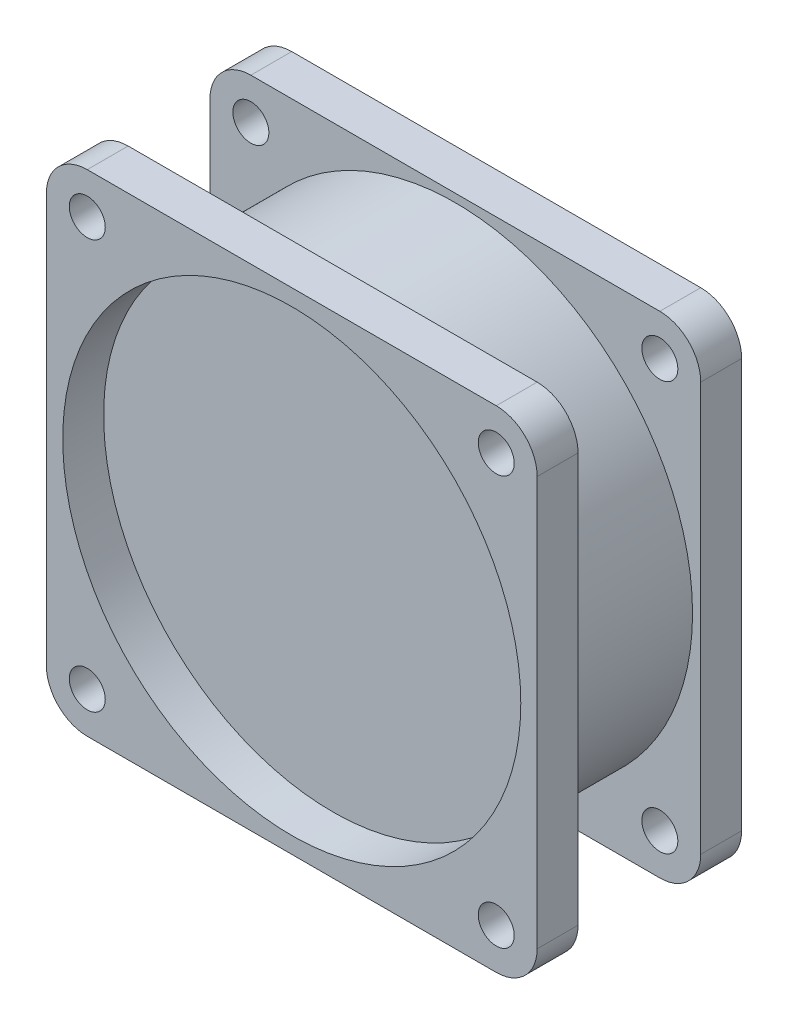
ISO-10303-21;
HEADER;
FILE_DESCRIPTION(('STEP AP214'),'2;1');
FILE_NAME('part.step','',(''),(''),'','','');
FILE_SCHEMA(('AUTOMOTIVE_DESIGN { 1 0 10303 214 1 1 1 1 }'));
ENDSEC;
DATA;
#1=APPLICATION_CONTEXT('core data for automotive mechanical design processes');
#2=APPLICATION_PROTOCOL_DEFINITION('international standard','automotive_design',2000,#1);
#3=PRODUCT_CONTEXT('',#1,'mechanical');
#4=PRODUCT('Part','Part','',(#3));
#5=PRODUCT_RELATED_PRODUCT_CATEGORY('part','',(#4));
#6=PRODUCT_DEFINITION_FORMATION('','',#4);
#7=PRODUCT_DEFINITION_CONTEXT('part definition',#1,'design');
#8=PRODUCT_DEFINITION('design','',#6,#7);
#9=PRODUCT_DEFINITION_SHAPE('','',#8);
#10=(LENGTH_UNIT() NAMED_UNIT(*) SI_UNIT(.MILLI.,.METRE.));
#11=(NAMED_UNIT(*) PLANE_ANGLE_UNIT() SI_UNIT($,.RADIAN.));
#12=(NAMED_UNIT(*) SI_UNIT($,.STERADIAN.) SOLID_ANGLE_UNIT());
#13=UNCERTAINTY_MEASURE_WITH_UNIT(LENGTH_MEASURE(1.E-05),#10,'distance_accuracy_value','');
#14=(GEOMETRIC_REPRESENTATION_CONTEXT(3) GLOBAL_UNCERTAINTY_ASSIGNED_CONTEXT((#13)) GLOBAL_UNIT_ASSIGNED_CONTEXT((#10,
#11,#12)) REPRESENTATION_CONTEXT('',''));
#15=CARTESIAN_POINT('',(0.,0.,0.));
#16=DIRECTION('',(0.,0.,1.));
#17=DIRECTION('',(1.,0.,0.));
#18=AXIS2_PLACEMENT_3D('',#15,#16,#17);
#19=CARTESIAN_POINT('',(0.,0.,5.));
#20=DIRECTION('',(-1.,0.,0.));
#21=DIRECTION('',(0.,0.,1.));
#22=AXIS2_PLACEMENT_3D('',#19,#20,#21);
#23=PLANE('',#22);
#24=DIRECTION('',(0.,1.,0.));
#25=VECTOR('',#24,1.);
#26=CARTESIAN_POINT('',(0.,0.,5.));
#27=LINE('',#26,#25);
#28=CARTESIAN_POINT('',(0.,-55.,5.));
#29=VERTEX_POINT('',#28);
#30=CARTESIAN_POINT('',(0.,-5.,5.));
#31=VERTEX_POINT('',#30);
#32=EDGE_CURVE('E175',#29,#31,#27,.T.);
#33=ORIENTED_EDGE('',*,*,#32,.F.);
#34=DIRECTION('',(0.,0.,-1.));
#35=VECTOR('',#34,1.);
#36=CARTESIAN_POINT('',(0.,-55.,5.));
#37=LINE('',#36,#35);
#38=CARTESIAN_POINT('',(0.,-55.,0.));
#39=VERTEX_POINT('',#38);
#40=EDGE_CURVE('E233',#29,#39,#37,.T.);
#41=ORIENTED_EDGE('',*,*,#40,.T.);
#42=DIRECTION('',(0.,1.,0.));
#43=VECTOR('',#42,1.);
#44=CARTESIAN_POINT('',(0.,0.,0.));
#45=LINE('',#44,#43);
#46=CARTESIAN_POINT('',(0.,-5.,0.));
#47=VERTEX_POINT('',#46);
#48=EDGE_CURVE('E309',#39,#47,#45,.T.);
#49=ORIENTED_EDGE('',*,*,#48,.T.);
#50=DIRECTION('',(0.,0.,-1.));
#51=VECTOR('',#50,1.);
#52=CARTESIAN_POINT('',(0.,-5.,5.));
#53=LINE('',#52,#51);
#54=EDGE_CURVE('E231',#47,#31,#53,.F.);
#55=ORIENTED_EDGE('',*,*,#54,.T.);
#56=EDGE_LOOP('',(#33,#41,#49,#55));
#57=FACE_BOUND('',#56,.T.);
#58=ADVANCED_FACE('F33',(#57),#23,.F.);
#59=CARTESIAN_POINT('',(0.,0.,5.));
#60=DIRECTION('',(0.,-1.,0.));
#61=DIRECTION('',(1.,0.,0.));
#62=AXIS2_PLACEMENT_3D('',#59,#60,#61);
#63=PLANE('',#62);
#64=DIRECTION('',(-1.,0.,0.));
#65=VECTOR('',#64,1.);
#66=CARTESIAN_POINT('',(0.,0.,0.));
#67=LINE('',#66,#65);
#68=CARTESIAN_POINT('',(-5.,0.,0.));
#69=VERTEX_POINT('',#68);
#70=CARTESIAN_POINT('',(-55.,0.,0.));
#71=VERTEX_POINT('',#70);
#72=EDGE_CURVE('E181',#69,#71,#67,.T.);
#73=ORIENTED_EDGE('',*,*,#72,.T.);
#74=DIRECTION('',(0.,0.,-1.));
#75=VECTOR('',#74,1.);
#76=CARTESIAN_POINT('',(-55.,0.,5.));
#77=LINE('',#76,#75);
#78=CARTESIAN_POINT('',(-55.,0.,5.));
#79=VERTEX_POINT('',#78);
#80=EDGE_CURVE('E11',#71,#79,#77,.F.);
#81=ORIENTED_EDGE('',*,*,#80,.T.);
#82=DIRECTION('',(-1.,0.,0.));
#83=VECTOR('',#82,1.);
#84=CARTESIAN_POINT('',(0.,0.,5.));
#85=LINE('',#84,#83);
#86=CARTESIAN_POINT('',(-5.,0.,5.));
#87=VERTEX_POINT('',#86);
#88=EDGE_CURVE('E179',#87,#79,#85,.T.);
#89=ORIENTED_EDGE('',*,*,#88,.F.);
#90=DIRECTION('',(0.,0.,-1.));
#91=VECTOR('',#90,1.);
#92=CARTESIAN_POINT('',(-5.,0.,5.));
#93=LINE('',#92,#91);
#94=EDGE_CURVE('E42',#87,#69,#93,.T.);
#95=ORIENTED_EDGE('',*,*,#94,.T.);
#96=EDGE_LOOP('',(#73,#81,#89,#95));
#97=FACE_BOUND('',#96,.T.);
#98=ADVANCED_FACE('F323',(#97),#63,.F.);
#99=CARTESIAN_POINT('',(-60.,0.,5.));
#100=DIRECTION('',(1.,0.,0.));
#101=DIRECTION('',(0.,1.,0.));
#102=AXIS2_PLACEMENT_3D('',#99,#100,#101);
#103=PLANE('',#102);
#104=DIRECTION('',(0.,-1.,0.));
#105=VECTOR('',#104,1.);
#106=CARTESIAN_POINT('',(-60.,0.,0.));
#107=LINE('',#106,#105);
#108=CARTESIAN_POINT('',(-60.,-5.00000000000001,0.));
#109=VERTEX_POINT('',#108);
#110=CARTESIAN_POINT('',(-60.,-55.,0.));
#111=VERTEX_POINT('',#110);
#112=EDGE_CURVE('E176',#109,#111,#107,.T.);
#113=ORIENTED_EDGE('',*,*,#112,.T.);
#114=DIRECTION('',(0.,0.,-1.));
#115=VECTOR('',#114,1.);
#116=CARTESIAN_POINT('',(-60.,-55.,5.));
#117=LINE('',#116,#115);
#118=CARTESIAN_POINT('',(-60.,-55.,5.));
#119=VERTEX_POINT('',#118);
#120=EDGE_CURVE('E154',#111,#119,#117,.F.);
#121=ORIENTED_EDGE('',*,*,#120,.T.);
#122=DIRECTION('',(0.,-1.,0.));
#123=VECTOR('',#122,1.);
#124=CARTESIAN_POINT('',(-60.,0.,5.));
#125=LINE('',#124,#123);
#126=CARTESIAN_POINT('',(-60.,-5.00000000000001,5.));
#127=VERTEX_POINT('',#126);
#128=EDGE_CURVE('E314',#127,#119,#125,.T.);
#129=ORIENTED_EDGE('',*,*,#128,.F.);
#130=DIRECTION('',(0.,0.,-1.));
#131=VECTOR('',#130,1.);
#132=CARTESIAN_POINT('',(-60.,-5.00000000000001,5.));
#133=LINE('',#132,#131);
#134=EDGE_CURVE('E159',#127,#109,#133,.T.);
#135=ORIENTED_EDGE('',*,*,#134,.T.);
#136=EDGE_LOOP('',(#113,#121,#129,#135));
#137=FACE_BOUND('',#136,.T.);
#138=ADVANCED_FACE('F334',(#137),#103,.F.);
#139=CARTESIAN_POINT('',(0.,-60.,5.));
#140=DIRECTION('',(0.,1.,0.));
#141=DIRECTION('',(-1.,0.,0.));
#142=AXIS2_PLACEMENT_3D('',#139,#140,#141);
#143=PLANE('',#142);
#144=DIRECTION('',(1.,0.,0.));
#145=VECTOR('',#144,1.);
#146=CARTESIAN_POINT('',(0.,-60.,5.));
#147=LINE('',#146,#145);
#148=CARTESIAN_POINT('',(-55.,-60.,5.));
#149=VERTEX_POINT('',#148);
#150=CARTESIAN_POINT('',(-5.,-60.,5.));
#151=VERTEX_POINT('',#150);
#152=EDGE_CURVE('E169',#149,#151,#147,.T.);
#153=ORIENTED_EDGE('',*,*,#152,.F.);
#154=DIRECTION('',(0.,0.,-1.));
#155=VECTOR('',#154,1.);
#156=CARTESIAN_POINT('',(-55.,-60.,5.));
#157=LINE('',#156,#155);
#158=CARTESIAN_POINT('',(-55.,-60.,0.));
#159=VERTEX_POINT('',#158);
#160=EDGE_CURVE('E153',#149,#159,#157,.T.);
#161=ORIENTED_EDGE('',*,*,#160,.T.);
#162=DIRECTION('',(1.,0.,0.));
#163=VECTOR('',#162,1.);
#164=CARTESIAN_POINT('',(0.,-60.,0.));
#165=LINE('',#164,#163);
#166=CARTESIAN_POINT('',(-5.,-60.,0.));
#167=VERTEX_POINT('',#166);
#168=EDGE_CURVE('E166',#159,#167,#165,.T.);
#169=ORIENTED_EDGE('',*,*,#168,.T.);
#170=DIRECTION('',(0.,0.,-1.));
#171=VECTOR('',#170,1.);
#172=CARTESIAN_POINT('',(-5.,-60.,5.));
#173=LINE('',#172,#171);
#174=EDGE_CURVE('E171',#167,#151,#173,.F.);
#175=ORIENTED_EDGE('',*,*,#174,.T.);
#176=EDGE_LOOP('',(#153,#161,#169,#175));
#177=FACE_BOUND('',#176,.T.);
#178=ADVANCED_FACE('F165',(#177),#143,.F.);
#179=CARTESIAN_POINT('',(0.,0.,5.));
#180=DIRECTION('',(0.,0.,-1.));
#181=DIRECTION('',(-1.,0.,0.));
#182=AXIS2_PLACEMENT_3D('',#179,#180,#181);
#183=PLANE('',#182);
#184=CARTESIAN_POINT('',(-30.,-30.,5.));
#185=DIRECTION('',(0.,0.,1.));
#186=DIRECTION('',(1.,0.,0.));
#187=AXIS2_PLACEMENT_3D('',#184,#185,#186);
#188=CIRCLE('',#187,28.);
#189=CARTESIAN_POINT('',(-1.99999999999999,-30.,5.));
#190=VERTEX_POINT('',#189);
#191=EDGE_CURVE('E679',#190,#190,#188,.T.);
#192=ORIENTED_EDGE('',*,*,#191,.F.);
#193=EDGE_LOOP('',(#192));
#194=FACE_BOUND('',#193,.T.);
#195=CARTESIAN_POINT('',(-54.9999999999995,-55.,5.));
#196=DIRECTION('',(0.,0.,1.));
#197=DIRECTION('',(1.,0.,0.));
#198=AXIS2_PLACEMENT_3D('',#195,#196,#197);
#199=CIRCLE('',#198,2.2);
#200=CARTESIAN_POINT('',(-52.7999999999995,-55.,5.));
#201=VERTEX_POINT('',#200);
#202=EDGE_CURVE('E667',#201,#201,#199,.T.);
#203=ORIENTED_EDGE('',*,*,#202,.F.);
#204=EDGE_LOOP('',(#203));
#205=FACE_BOUND('',#204,.T.);
#206=CARTESIAN_POINT('',(-4.99999999999948,-55.,5.));
#207=DIRECTION('',(0.,0.,1.));
#208=DIRECTION('',(1.,0.,0.));
#209=AXIS2_PLACEMENT_3D('',#206,#207,#208);
#210=CIRCLE('',#209,2.2);
#211=CARTESIAN_POINT('',(-2.79999999999948,-55.,5.));
#212=VERTEX_POINT('',#211);
#213=EDGE_CURVE('E261',#212,#212,#210,.T.);
#214=ORIENTED_EDGE('',*,*,#213,.F.);
#215=EDGE_LOOP('',(#214));
#216=FACE_BOUND('',#215,.T.);
#217=CARTESIAN_POINT('',(-5.,-5.,5.));
#218=DIRECTION('',(0.,0.,1.));
#219=DIRECTION('',(1.,0.,0.));
#220=AXIS2_PLACEMENT_3D('',#217,#218,#219);
#221=CIRCLE('',#220,2.2);
#222=CARTESIAN_POINT('',(-2.8,-5.,5.));
#223=VERTEX_POINT('',#222);
#224=EDGE_CURVE('E258',#223,#223,#221,.T.);
#225=ORIENTED_EDGE('',*,*,#224,.F.);
#226=EDGE_LOOP('',(#225));
#227=FACE_BOUND('',#226,.T.);
#228=CARTESIAN_POINT('',(-55.,-5.,5.));
#229=DIRECTION('',(0.,0.,1.));
#230=DIRECTION('',(1.,0.,0.));
#231=AXIS2_PLACEMENT_3D('',#228,#229,#230);
#232=CIRCLE('',#231,2.2);
#233=CARTESIAN_POINT('',(-52.8,-5.,5.));
#234=VERTEX_POINT('',#233);
#235=EDGE_CURVE('E277',#234,#234,#232,.T.);
#236=ORIENTED_EDGE('',*,*,#235,.F.);
#237=EDGE_LOOP('',(#236));
#238=FACE_BOUND('',#237,.T.);
#239=ORIENTED_EDGE('',*,*,#128,.T.);
#240=CARTESIAN_POINT('',(-55.,-55.,5.));
#241=DIRECTION('',(0.,0.,-1.));
#242=DIRECTION('',(-1.,0.,0.));
#243=AXIS2_PLACEMENT_3D('',#240,#241,#242);
#244=CIRCLE('',#243,5.);
#245=EDGE_CURVE('E199',#119,#149,#244,.F.);
#246=ORIENTED_EDGE('',*,*,#245,.T.);
#247=ORIENTED_EDGE('',*,*,#152,.T.);
#248=CARTESIAN_POINT('',(-5.,-55.,5.));
#249=DIRECTION('',(0.,0.,-1.));
#250=DIRECTION('',(-1.,0.,0.));
#251=AXIS2_PLACEMENT_3D('',#248,#249,#250);
#252=CIRCLE('',#251,5.);
#253=EDGE_CURVE('E197',#151,#29,#252,.F.);
#254=ORIENTED_EDGE('',*,*,#253,.T.);
#255=ORIENTED_EDGE('',*,*,#32,.T.);
#256=CARTESIAN_POINT('',(-5.,-5.,5.));
#257=DIRECTION('',(0.,0.,-1.));
#258=DIRECTION('',(-1.,0.,0.));
#259=AXIS2_PLACEMENT_3D('',#256,#257,#258);
#260=CIRCLE('',#259,5.);
#261=EDGE_CURVE('E193',#31,#87,#260,.F.);
#262=ORIENTED_EDGE('',*,*,#261,.T.);
#263=ORIENTED_EDGE('',*,*,#88,.T.);
#264=CARTESIAN_POINT('',(-55.,-5.00000000000001,5.));
#265=DIRECTION('',(0.,0.,-1.));
#266=DIRECTION('',(-1.,0.,0.));
#267=AXIS2_PLACEMENT_3D('',#264,#265,#266);
#268=CIRCLE('',#267,5.);
#269=EDGE_CURVE('E195',#79,#127,#268,.F.);
#270=ORIENTED_EDGE('',*,*,#269,.T.);
#271=EDGE_LOOP('',(#239,#246,#247,#254,#255,#262,#263,#270));
#272=FACE_BOUND('',#271,.T.);
#273=ADVANCED_FACE('F332',(#194,#205,#216,#227,#238,#272),#183,.F.);
#274=CARTESIAN_POINT('',(0.,0.,0.));
#275=DIRECTION('',(0.,0.,-1.));
#276=DIRECTION('',(-1.,0.,0.));
#277=AXIS2_PLACEMENT_3D('',#274,#275,#276);
#278=PLANE('',#277);
#279=CARTESIAN_POINT('',(-54.9999999999995,-55.,0.));
#280=DIRECTION('',(0.,0.,-1.));
#281=DIRECTION('',(-1.,0.,0.));
#282=AXIS2_PLACEMENT_3D('',#279,#280,#281);
#283=CIRCLE('',#282,2.2);
#284=CARTESIAN_POINT('',(-57.1999999999995,-55.,0.));
#285=VERTEX_POINT('',#284);
#286=EDGE_CURVE('E266',#285,#285,#283,.T.);
#287=ORIENTED_EDGE('',*,*,#286,.F.);
#288=EDGE_LOOP('',(#287));
#289=FACE_BOUND('',#288,.T.);
#290=CARTESIAN_POINT('',(-4.99999999999948,-55.,0.));
#291=DIRECTION('',(0.,0.,-1.));
#292=DIRECTION('',(-1.,0.,0.));
#293=AXIS2_PLACEMENT_3D('',#290,#291,#292);
#294=CIRCLE('',#293,2.2);
#295=CARTESIAN_POINT('',(-7.19999999999948,-55.,0.));
#296=VERTEX_POINT('',#295);
#297=EDGE_CURVE('E253',#296,#296,#294,.T.);
#298=ORIENTED_EDGE('',*,*,#297,.F.);
#299=EDGE_LOOP('',(#298));
#300=FACE_BOUND('',#299,.T.);
#301=CARTESIAN_POINT('',(-5.,-5.,0.));
#302=DIRECTION('',(0.,0.,-1.));
#303=DIRECTION('',(-1.,0.,0.));
#304=AXIS2_PLACEMENT_3D('',#301,#302,#303);
#305=CIRCLE('',#304,2.2);
#306=CARTESIAN_POINT('',(-7.2,-5.,0.));
#307=VERTEX_POINT('',#306);
#308=EDGE_CURVE('E249',#307,#307,#305,.T.);
#309=ORIENTED_EDGE('',*,*,#308,.F.);
#310=EDGE_LOOP('',(#309));
#311=FACE_BOUND('',#310,.T.);
#312=CARTESIAN_POINT('',(-55.,-5.,0.));
#313=DIRECTION('',(0.,0.,-1.));
#314=DIRECTION('',(-1.,0.,0.));
#315=AXIS2_PLACEMENT_3D('',#312,#313,#314);
#316=CIRCLE('',#315,2.2);
#317=CARTESIAN_POINT('',(-57.2,-5.,0.));
#318=VERTEX_POINT('',#317);
#319=EDGE_CURVE('E245',#318,#318,#316,.T.);
#320=ORIENTED_EDGE('',*,*,#319,.F.);
#321=EDGE_LOOP('',(#320));
#322=FACE_BOUND('',#321,.T.);
#323=CARTESIAN_POINT('',(-30.,-30.,0.));
#324=DIRECTION('',(0.,0.,-1.));
#325=DIRECTION('',(-1.,0.,0.));
#326=AXIS2_PLACEMENT_3D('',#323,#324,#325);
#327=CIRCLE('',#326,29.);
#328=CARTESIAN_POINT('',(-59.,-30.,0.));
#329=VERTEX_POINT('',#328);
#330=EDGE_CURVE('E296',#329,#329,#327,.T.);
#331=ORIENTED_EDGE('',*,*,#330,.F.);
#332=EDGE_LOOP('',(#331));
#333=FACE_BOUND('',#332,.T.);
#334=ORIENTED_EDGE('',*,*,#168,.F.);
#335=CARTESIAN_POINT('',(-55.,-55.,0.));
#336=DIRECTION('',(0.,0.,-1.));
#337=DIRECTION('',(-1.,0.,0.));
#338=AXIS2_PLACEMENT_3D('',#335,#336,#337);
#339=CIRCLE('',#338,5.);
#340=EDGE_CURVE('E149',#159,#111,#339,.T.);
#341=ORIENTED_EDGE('',*,*,#340,.T.);
#342=ORIENTED_EDGE('',*,*,#112,.F.);
#343=CARTESIAN_POINT('',(-55.,-5.00000000000001,0.));
#344=DIRECTION('',(0.,0.,-1.));
#345=DIRECTION('',(-1.,0.,0.));
#346=AXIS2_PLACEMENT_3D('',#343,#344,#345);
#347=CIRCLE('',#346,5.);
#348=EDGE_CURVE('E187',#109,#71,#347,.T.);
#349=ORIENTED_EDGE('',*,*,#348,.T.);
#350=ORIENTED_EDGE('',*,*,#72,.F.);
#351=CARTESIAN_POINT('',(-5.,-5.,0.));
#352=DIRECTION('',(0.,0.,-1.));
#353=DIRECTION('',(-1.,0.,0.));
#354=AXIS2_PLACEMENT_3D('',#351,#352,#353);
#355=CIRCLE('',#354,5.);
#356=EDGE_CURVE('E170',#69,#47,#355,.T.);
#357=ORIENTED_EDGE('',*,*,#356,.T.);
#358=ORIENTED_EDGE('',*,*,#48,.F.);
#359=CARTESIAN_POINT('',(-5.,-55.,0.));
#360=DIRECTION('',(0.,0.,-1.));
#361=DIRECTION('',(-1.,0.,0.));
#362=AXIS2_PLACEMENT_3D('',#359,#360,#361);
#363=CIRCLE('',#362,5.);
#364=EDGE_CURVE('E160',#39,#167,#363,.T.);
#365=ORIENTED_EDGE('',*,*,#364,.T.);
#366=EDGE_LOOP('',(#334,#341,#342,#349,#350,#357,#358,#365));
#367=FACE_BOUND('',#366,.T.);
#368=ADVANCED_FACE('F173',(#289,#300,#311,#322,#333,#367),#278,.T.);
#369=CARTESIAN_POINT('',(-30.,-30.,-15.));
#370=DIRECTION('',(0.,0.,1.));
#371=DIRECTION('',(1.,0.,0.));
#372=AXIS2_PLACEMENT_3D('',#369,#370,#371);
#373=CYLINDRICAL_SURFACE('',#372,29.);
#374=CARTESIAN_POINT('',(-30.,-30.,-15.));
#375=DIRECTION('',(0.,0.,-1.));
#376=DIRECTION('',(-1.,0.,0.));
#377=AXIS2_PLACEMENT_3D('',#374,#375,#376);
#378=CIRCLE('',#377,29.);
#379=CARTESIAN_POINT('',(-59.,-30.,-15.));
#380=VERTEX_POINT('',#379);
#381=EDGE_CURVE('E306',#380,#380,#378,.T.);
#382=ORIENTED_EDGE('',*,*,#381,.F.);
#383=EDGE_LOOP('',(#382));
#384=FACE_BOUND('',#383,.T.);
#385=ORIENTED_EDGE('',*,*,#330,.T.);
#386=EDGE_LOOP('',(#385));
#387=FACE_BOUND('',#386,.T.);
#388=ADVANCED_FACE('F420',(#384,#387),#373,.T.);
#389=CARTESIAN_POINT('',(0.,0.,-20.));
#390=DIRECTION('',(-1.,0.,0.));
#391=DIRECTION('',(0.,-1.,0.));
#392=AXIS2_PLACEMENT_3D('',#389,#390,#391);
#393=PLANE('',#392);
#394=DIRECTION('',(0.,-1.,0.));
#395=VECTOR('',#394,1.);
#396=CARTESIAN_POINT('',(0.,0.,-15.));
#397=LINE('',#396,#395);
#398=CARTESIAN_POINT('',(0.,-5.,-15.));
#399=VERTEX_POINT('',#398);
#400=CARTESIAN_POINT('',(0.,-55.,-15.));
#401=VERTEX_POINT('',#400);
#402=EDGE_CURVE('E284',#399,#401,#397,.T.);
#403=ORIENTED_EDGE('',*,*,#402,.T.);
#404=DIRECTION('',(0.,0.,1.));
#405=VECTOR('',#404,1.);
#406=CARTESIAN_POINT('',(0.,-55.,-20.));
#407=LINE('',#406,#405);
#408=CARTESIAN_POINT('',(0.,-55.,-20.));
#409=VERTEX_POINT('',#408);
#410=EDGE_CURVE('E229',#401,#409,#407,.F.);
#411=ORIENTED_EDGE('',*,*,#410,.T.);
#412=DIRECTION('',(0.,-1.,0.));
#413=VECTOR('',#412,1.);
#414=CARTESIAN_POINT('',(0.,0.,-20.));
#415=LINE('',#414,#413);
#416=CARTESIAN_POINT('',(0.,-5.,-20.));
#417=VERTEX_POINT('',#416);
#418=EDGE_CURVE('E285',#417,#409,#415,.T.);
#419=ORIENTED_EDGE('',*,*,#418,.F.);
#420=DIRECTION('',(0.,0.,1.));
#421=VECTOR('',#420,1.);
#422=CARTESIAN_POINT('',(0.,-5.,-20.));
#423=LINE('',#422,#421);
#424=EDGE_CURVE('E226',#417,#399,#423,.T.);
#425=ORIENTED_EDGE('',*,*,#424,.T.);
#426=EDGE_LOOP('',(#403,#411,#419,#425));
#427=FACE_BOUND('',#426,.T.);
#428=ADVANCED_FACE('F416',(#427),#393,.F.);
#429=CARTESIAN_POINT('',(0.,-60.,-20.));
#430=DIRECTION('',(0.,1.,0.));
#431=DIRECTION('',(0.,0.,1.));
#432=AXIS2_PLACEMENT_3D('',#429,#430,#431);
#433=PLANE('',#432);
#434=DIRECTION('',(-1.,0.,0.));
#435=VECTOR('',#434,1.);
#436=CARTESIAN_POINT('',(0.,-60.,-15.));
#437=LINE('',#436,#435);
#438=CARTESIAN_POINT('',(-5.00000000000001,-60.,-15.));
#439=VERTEX_POINT('',#438);
#440=CARTESIAN_POINT('',(-55.,-60.,-15.));
#441=VERTEX_POINT('',#440);
#442=EDGE_CURVE('E299',#439,#441,#437,.T.);
#443=ORIENTED_EDGE('',*,*,#442,.T.);
#444=DIRECTION('',(0.,0.,1.));
#445=VECTOR('',#444,1.);
#446=CARTESIAN_POINT('',(-55.,-60.,-20.));
#447=LINE('',#446,#445);
#448=CARTESIAN_POINT('',(-55.,-60.,-20.));
#449=VERTEX_POINT('',#448);
#450=EDGE_CURVE('E217',#441,#449,#447,.F.);
#451=ORIENTED_EDGE('',*,*,#450,.T.);
#452=DIRECTION('',(-1.,0.,0.));
#453=VECTOR('',#452,1.);
#454=CARTESIAN_POINT('',(0.,-60.,-20.));
#455=LINE('',#454,#453);
#456=CARTESIAN_POINT('',(-5.00000000000001,-60.,-20.));
#457=VERTEX_POINT('',#456);
#458=EDGE_CURVE('E288',#457,#449,#455,.T.);
#459=ORIENTED_EDGE('',*,*,#458,.F.);
#460=DIRECTION('',(0.,0.,1.));
#461=VECTOR('',#460,1.);
#462=CARTESIAN_POINT('',(-5.00000000000001,-60.,-20.));
#463=LINE('',#462,#461);
#464=EDGE_CURVE('E214',#457,#439,#463,.T.);
#465=ORIENTED_EDGE('',*,*,#464,.T.);
#466=EDGE_LOOP('',(#443,#451,#459,#465));
#467=FACE_BOUND('',#466,.T.);
#468=ADVANCED_FACE('F412',(#467),#433,.F.);
#469=CARTESIAN_POINT('',(-60.,0.,-20.));
#470=DIRECTION('',(1.,0.,0.));
#471=DIRECTION('',(0.,1.,0.));
#472=AXIS2_PLACEMENT_3D('',#469,#470,#471);
#473=PLANE('',#472);
#474=DIRECTION('',(0.,1.,0.));
#475=VECTOR('',#474,1.);
#476=CARTESIAN_POINT('',(-60.,0.,-20.));
#477=LINE('',#476,#475);
#478=CARTESIAN_POINT('',(-60.,-55.,-20.));
#479=VERTEX_POINT('',#478);
#480=CARTESIAN_POINT('',(-60.,-5.,-20.));
#481=VERTEX_POINT('',#480);
#482=EDGE_CURVE('E292',#479,#481,#477,.T.);
#483=ORIENTED_EDGE('',*,*,#482,.F.);
#484=DIRECTION('',(0.,0.,1.));
#485=VECTOR('',#484,1.);
#486=CARTESIAN_POINT('',(-60.,-55.,-20.));
#487=LINE('',#486,#485);
#488=CARTESIAN_POINT('',(-60.,-55.,-15.));
#489=VERTEX_POINT('',#488);
#490=EDGE_CURVE('E203',#479,#489,#487,.T.);
#491=ORIENTED_EDGE('',*,*,#490,.T.);
#492=DIRECTION('',(0.,1.,0.));
#493=VECTOR('',#492,1.);
#494=CARTESIAN_POINT('',(-60.,0.,-15.));
#495=LINE('',#494,#493);
#496=CARTESIAN_POINT('',(-60.,-5.,-15.));
#497=VERTEX_POINT('',#496);
#498=EDGE_CURVE('E302',#489,#497,#495,.T.);
#499=ORIENTED_EDGE('',*,*,#498,.T.);
#500=DIRECTION('',(0.,0.,1.));
#501=VECTOR('',#500,1.);
#502=CARTESIAN_POINT('',(-60.,-5.,-20.));
#503=LINE('',#502,#501);
#504=EDGE_CURVE('E201',#497,#481,#503,.F.);
#505=ORIENTED_EDGE('',*,*,#504,.T.);
#506=EDGE_LOOP('',(#483,#491,#499,#505));
#507=FACE_BOUND('',#506,.T.);
#508=ADVANCED_FACE('F409',(#507),#473,.F.);
#509=CARTESIAN_POINT('',(0.,0.,-20.));
#510=DIRECTION('',(0.,-1.,0.));
#511=DIRECTION('',(0.,0.,-1.));
#512=AXIS2_PLACEMENT_3D('',#509,#510,#511);
#513=PLANE('',#512);
#514=DIRECTION('',(1.,0.,0.));
#515=VECTOR('',#514,1.);
#516=CARTESIAN_POINT('',(0.,0.,-15.));
#517=LINE('',#516,#515);
#518=CARTESIAN_POINT('',(-55.,0.,-15.));
#519=VERTEX_POINT('',#518);
#520=CARTESIAN_POINT('',(-5.,0.,-15.));
#521=VERTEX_POINT('',#520);
#522=EDGE_CURVE('E289',#519,#521,#517,.T.);
#523=ORIENTED_EDGE('',*,*,#522,.T.);
#524=DIRECTION('',(0.,0.,1.));
#525=VECTOR('',#524,1.);
#526=CARTESIAN_POINT('',(-5.,0.,-20.));
#527=LINE('',#526,#525);
#528=CARTESIAN_POINT('',(-5.,0.,-20.));
#529=VERTEX_POINT('',#528);
#530=EDGE_CURVE('E50',#521,#529,#527,.F.);
#531=ORIENTED_EDGE('',*,*,#530,.T.);
#532=DIRECTION('',(1.,0.,0.));
#533=VECTOR('',#532,1.);
#534=CARTESIAN_POINT('',(0.,0.,-20.));
#535=LINE('',#534,#533);
#536=CARTESIAN_POINT('',(-55.,0.,-20.));
#537=VERTEX_POINT('',#536);
#538=EDGE_CURVE('E294',#537,#529,#535,.T.);
#539=ORIENTED_EDGE('',*,*,#538,.F.);
#540=DIRECTION('',(0.,0.,1.));
#541=VECTOR('',#540,1.);
#542=CARTESIAN_POINT('',(-55.,0.,-20.));
#543=LINE('',#542,#541);
#544=EDGE_CURVE('E236',#537,#519,#543,.T.);
#545=ORIENTED_EDGE('',*,*,#544,.T.);
#546=EDGE_LOOP('',(#523,#531,#539,#545));
#547=FACE_BOUND('',#546,.T.);
#548=ADVANCED_FACE('F402',(#547),#513,.F.);
#549=CARTESIAN_POINT('',(0.,0.,-20.));
#550=DIRECTION('',(0.,0.,-1.));
#551=DIRECTION('',(-1.,0.,0.));
#552=AXIS2_PLACEMENT_3D('',#549,#550,#551);
#553=PLANE('',#552);
#554=CARTESIAN_POINT('',(-30.,-30.,-20.));
#555=DIRECTION('',(0.,0.,-1.));
#556=DIRECTION('',(-1.,0.,0.));
#557=AXIS2_PLACEMENT_3D('',#554,#555,#556);
#558=CIRCLE('',#557,28.);
#559=CARTESIAN_POINT('',(-58.,-30.,-20.));
#560=VERTEX_POINT('',#559);
#561=EDGE_CURVE('E673',#560,#560,#558,.T.);
#562=ORIENTED_EDGE('',*,*,#561,.F.);
#563=EDGE_LOOP('',(#562));
#564=FACE_BOUND('',#563,.T.);
#565=CARTESIAN_POINT('',(-54.9999999999995,-55.,-20.));
#566=DIRECTION('',(0.,0.,1.));
#567=DIRECTION('',(1.,0.,0.));
#568=AXIS2_PLACEMENT_3D('',#565,#566,#567);
#569=CIRCLE('',#568,2.2);
#570=CARTESIAN_POINT('',(-52.7999999999995,-55.,-20.));
#571=VERTEX_POINT('',#570);
#572=EDGE_CURVE('E664',#571,#571,#569,.T.);
#573=ORIENTED_EDGE('',*,*,#572,.T.);
#574=EDGE_LOOP('',(#573));
#575=FACE_BOUND('',#574,.T.);
#576=CARTESIAN_POINT('',(-4.99999999999948,-55.,-20.));
#577=DIRECTION('',(0.,0.,1.));
#578=DIRECTION('',(1.,0.,0.));
#579=AXIS2_PLACEMENT_3D('',#576,#577,#578);
#580=CIRCLE('',#579,2.2);
#581=CARTESIAN_POINT('',(-2.79999999999948,-55.,-20.));
#582=VERTEX_POINT('',#581);
#583=EDGE_CURVE('E254',#582,#582,#580,.T.);
#584=ORIENTED_EDGE('',*,*,#583,.T.);
#585=EDGE_LOOP('',(#584));
#586=FACE_BOUND('',#585,.T.);
#587=CARTESIAN_POINT('',(-5.,-5.,-20.));
#588=DIRECTION('',(0.,0.,1.));
#589=DIRECTION('',(1.,0.,0.));
#590=AXIS2_PLACEMENT_3D('',#587,#588,#589);
#591=CIRCLE('',#590,2.2);
#592=CARTESIAN_POINT('',(-2.8,-5.,-20.));
#593=VERTEX_POINT('',#592);
#594=EDGE_CURVE('E250',#593,#593,#591,.T.);
#595=ORIENTED_EDGE('',*,*,#594,.T.);
#596=EDGE_LOOP('',(#595));
#597=FACE_BOUND('',#596,.T.);
#598=CARTESIAN_POINT('',(-55.,-5.,-20.));
#599=DIRECTION('',(0.,0.,1.));
#600=DIRECTION('',(1.,0.,0.));
#601=AXIS2_PLACEMENT_3D('',#598,#599,#600);
#602=CIRCLE('',#601,2.2);
#603=CARTESIAN_POINT('',(-52.8,-5.,-20.));
#604=VERTEX_POINT('',#603);
#605=EDGE_CURVE('E246',#604,#604,#602,.T.);
#606=ORIENTED_EDGE('',*,*,#605,.T.);
#607=EDGE_LOOP('',(#606));
#608=FACE_BOUND('',#607,.T.);
#609=ORIENTED_EDGE('',*,*,#458,.T.);
#610=CARTESIAN_POINT('',(-55.,-55.,-20.));
#611=DIRECTION('',(0.,0.,-1.));
#612=DIRECTION('',(-1.,0.,0.));
#613=AXIS2_PLACEMENT_3D('',#610,#611,#612);
#614=CIRCLE('',#613,5.);
#615=EDGE_CURVE('E224',#449,#479,#614,.T.);
#616=ORIENTED_EDGE('',*,*,#615,.T.);
#617=ORIENTED_EDGE('',*,*,#482,.T.);
#618=CARTESIAN_POINT('',(-55.,-5.,-20.));
#619=DIRECTION('',(0.,0.,-1.));
#620=DIRECTION('',(-1.,0.,0.));
#621=AXIS2_PLACEMENT_3D('',#618,#619,#620);
#622=CIRCLE('',#621,5.);
#623=EDGE_CURVE('E57',#481,#537,#622,.T.);
#624=ORIENTED_EDGE('',*,*,#623,.T.);
#625=ORIENTED_EDGE('',*,*,#538,.T.);
#626=CARTESIAN_POINT('',(-5.,-5.,-20.));
#627=DIRECTION('',(0.,0.,-1.));
#628=DIRECTION('',(-1.,0.,0.));
#629=AXIS2_PLACEMENT_3D('',#626,#627,#628);
#630=CIRCLE('',#629,5.);
#631=EDGE_CURVE('E220',#529,#417,#630,.T.);
#632=ORIENTED_EDGE('',*,*,#631,.T.);
#633=ORIENTED_EDGE('',*,*,#418,.T.);
#634=CARTESIAN_POINT('',(-5.00000000000001,-55.,-20.));
#635=DIRECTION('',(0.,0.,-1.));
#636=DIRECTION('',(-1.,0.,0.));
#637=AXIS2_PLACEMENT_3D('',#634,#635,#636);
#638=CIRCLE('',#637,5.);
#639=EDGE_CURVE('E222',#409,#457,#638,.T.);
#640=ORIENTED_EDGE('',*,*,#639,.T.);
#641=EDGE_LOOP('',(#609,#616,#617,#624,#625,#632,#633,#640));
#642=FACE_BOUND('',#641,.T.);
#643=ADVANCED_FACE('F399',(#564,#575,#586,#597,#608,#642),#553,.T.);
#644=CARTESIAN_POINT('',(0.,0.,-15.));
#645=DIRECTION('',(0.,0.,-1.));
#646=DIRECTION('',(-1.,0.,0.));
#647=AXIS2_PLACEMENT_3D('',#644,#645,#646);
#648=PLANE('',#647);
#649=CARTESIAN_POINT('',(-54.9999999999995,-55.,-15.));
#650=DIRECTION('',(0.,0.,-1.));
#651=DIRECTION('',(-1.,0.,0.));
#652=AXIS2_PLACEMENT_3D('',#649,#650,#651);
#653=CIRCLE('',#652,2.2);
#654=CARTESIAN_POINT('',(-57.1999999999995,-55.,-15.));
#655=VERTEX_POINT('',#654);
#656=EDGE_CURVE('E37',#655,#655,#653,.T.);
#657=ORIENTED_EDGE('',*,*,#656,.T.);
#658=EDGE_LOOP('',(#657));
#659=FACE_BOUND('',#658,.T.);
#660=CARTESIAN_POINT('',(-4.99999999999948,-55.,-15.));
#661=DIRECTION('',(0.,0.,-1.));
#662=DIRECTION('',(-1.,0.,0.));
#663=AXIS2_PLACEMENT_3D('',#660,#661,#662);
#664=CIRCLE('',#663,2.2);
#665=CARTESIAN_POINT('',(-7.19999999999948,-55.,-15.));
#666=VERTEX_POINT('',#665);
#667=EDGE_CURVE('E251',#666,#666,#664,.T.);
#668=ORIENTED_EDGE('',*,*,#667,.T.);
#669=EDGE_LOOP('',(#668));
#670=FACE_BOUND('',#669,.T.);
#671=CARTESIAN_POINT('',(-5.,-5.,-15.));
#672=DIRECTION('',(0.,0.,-1.));
#673=DIRECTION('',(-1.,0.,0.));
#674=AXIS2_PLACEMENT_3D('',#671,#672,#673);
#675=CIRCLE('',#674,2.2);
#676=CARTESIAN_POINT('',(-7.2,-5.,-15.));
#677=VERTEX_POINT('',#676);
#678=EDGE_CURVE('E247',#677,#677,#675,.T.);
#679=ORIENTED_EDGE('',*,*,#678,.T.);
#680=EDGE_LOOP('',(#679));
#681=FACE_BOUND('',#680,.T.);
#682=CARTESIAN_POINT('',(-55.,-5.,-15.));
#683=DIRECTION('',(0.,0.,-1.));
#684=DIRECTION('',(-1.,0.,0.));
#685=AXIS2_PLACEMENT_3D('',#682,#683,#684);
#686=CIRCLE('',#685,2.2);
#687=CARTESIAN_POINT('',(-57.2,-5.,-15.));
#688=VERTEX_POINT('',#687);
#689=EDGE_CURVE('E242',#688,#688,#686,.T.);
#690=ORIENTED_EDGE('',*,*,#689,.T.);
#691=EDGE_LOOP('',(#690));
#692=FACE_BOUND('',#691,.T.);
#693=ORIENTED_EDGE('',*,*,#381,.T.);
#694=EDGE_LOOP('',(#693));
#695=FACE_BOUND('',#694,.T.);
#696=ORIENTED_EDGE('',*,*,#498,.F.);
#697=CARTESIAN_POINT('',(-55.,-55.,-15.));
#698=DIRECTION('',(0.,0.,-1.));
#699=DIRECTION('',(-1.,0.,0.));
#700=AXIS2_PLACEMENT_3D('',#697,#698,#699);
#701=CIRCLE('',#700,5.);
#702=EDGE_CURVE('E212',#489,#441,#701,.F.);
#703=ORIENTED_EDGE('',*,*,#702,.T.);
#704=ORIENTED_EDGE('',*,*,#442,.F.);
#705=CARTESIAN_POINT('',(-5.00000000000001,-55.,-15.));
#706=DIRECTION('',(0.,0.,-1.));
#707=DIRECTION('',(-1.,0.,0.));
#708=AXIS2_PLACEMENT_3D('',#705,#706,#707);
#709=CIRCLE('',#708,5.);
#710=EDGE_CURVE('E210',#439,#401,#709,.F.);
#711=ORIENTED_EDGE('',*,*,#710,.T.);
#712=ORIENTED_EDGE('',*,*,#402,.F.);
#713=CARTESIAN_POINT('',(-5.,-5.,-15.));
#714=DIRECTION('',(0.,0.,-1.));
#715=DIRECTION('',(-1.,0.,0.));
#716=AXIS2_PLACEMENT_3D('',#713,#714,#715);
#717=CIRCLE('',#716,5.);
#718=EDGE_CURVE('E208',#399,#521,#717,.F.);
#719=ORIENTED_EDGE('',*,*,#718,.T.);
#720=ORIENTED_EDGE('',*,*,#522,.F.);
#721=CARTESIAN_POINT('',(-55.,-5.,-15.));
#722=DIRECTION('',(0.,0.,-1.));
#723=DIRECTION('',(-1.,0.,0.));
#724=AXIS2_PLACEMENT_3D('',#721,#722,#723);
#725=CIRCLE('',#724,5.);
#726=EDGE_CURVE('E206',#519,#497,#725,.F.);
#727=ORIENTED_EDGE('',*,*,#726,.T.);
#728=EDGE_LOOP('',(#696,#703,#704,#711,#712,#719,#720,#727));
#729=FACE_BOUND('',#728,.T.);
#730=ADVANCED_FACE('F353',(#659,#670,#681,#692,#695,#729),#648,.F.);
#731=CARTESIAN_POINT('',(-55.,-55.,5.));
#732=DIRECTION('',(0.,0.,-1.));
#733=DIRECTION('',(-1.,0.,0.));
#734=AXIS2_PLACEMENT_3D('',#731,#732,#733);
#735=CYLINDRICAL_SURFACE('',#734,5.);
#736=ORIENTED_EDGE('',*,*,#245,.F.);
#737=ORIENTED_EDGE('',*,*,#120,.F.);
#738=ORIENTED_EDGE('',*,*,#340,.F.);
#739=ORIENTED_EDGE('',*,*,#160,.F.);
#740=EDGE_LOOP('',(#736,#737,#738,#739));
#741=FACE_BOUND('',#740,.T.);
#742=ADVANCED_FACE('F152',(#741),#735,.T.);
#743=CARTESIAN_POINT('',(-55.,-55.,-20.));
#744=DIRECTION('',(0.,0.,1.));
#745=DIRECTION('',(1.,0.,0.));
#746=AXIS2_PLACEMENT_3D('',#743,#744,#745);
#747=CYLINDRICAL_SURFACE('',#746,5.);
#748=ORIENTED_EDGE('',*,*,#615,.F.);
#749=ORIENTED_EDGE('',*,*,#450,.F.);
#750=ORIENTED_EDGE('',*,*,#702,.F.);
#751=ORIENTED_EDGE('',*,*,#490,.F.);
#752=EDGE_LOOP('',(#748,#749,#750,#751));
#753=FACE_BOUND('',#752,.T.);
#754=ADVANCED_FACE('F352',(#753),#747,.T.);
#755=CARTESIAN_POINT('',(-5.00000000000001,-55.,-20.));
#756=DIRECTION('',(0.,0.,1.));
#757=DIRECTION('',(1.,0.,0.));
#758=AXIS2_PLACEMENT_3D('',#755,#756,#757);
#759=CYLINDRICAL_SURFACE('',#758,5.);
#760=ORIENTED_EDGE('',*,*,#639,.F.);
#761=ORIENTED_EDGE('',*,*,#410,.F.);
#762=ORIENTED_EDGE('',*,*,#710,.F.);
#763=ORIENTED_EDGE('',*,*,#464,.F.);
#764=EDGE_LOOP('',(#760,#761,#762,#763));
#765=FACE_BOUND('',#764,.T.);
#766=ADVANCED_FACE('F356',(#765),#759,.T.);
#767=CARTESIAN_POINT('',(-5.,-55.,5.));
#768=DIRECTION('',(0.,0.,-1.));
#769=DIRECTION('',(-1.,0.,0.));
#770=AXIS2_PLACEMENT_3D('',#767,#768,#769);
#771=CYLINDRICAL_SURFACE('',#770,5.);
#772=ORIENTED_EDGE('',*,*,#253,.F.);
#773=ORIENTED_EDGE('',*,*,#174,.F.);
#774=ORIENTED_EDGE('',*,*,#364,.F.);
#775=ORIENTED_EDGE('',*,*,#40,.F.);
#776=EDGE_LOOP('',(#772,#773,#774,#775));
#777=FACE_BOUND('',#776,.T.);
#778=ADVANCED_FACE('F360',(#777),#771,.T.);
#779=CARTESIAN_POINT('',(-5.,-5.,-20.));
#780=DIRECTION('',(0.,0.,1.));
#781=DIRECTION('',(1.,0.,0.));
#782=AXIS2_PLACEMENT_3D('',#779,#780,#781);
#783=CYLINDRICAL_SURFACE('',#782,5.);
#784=ORIENTED_EDGE('',*,*,#631,.F.);
#785=ORIENTED_EDGE('',*,*,#530,.F.);
#786=ORIENTED_EDGE('',*,*,#718,.F.);
#787=ORIENTED_EDGE('',*,*,#424,.F.);
#788=EDGE_LOOP('',(#784,#785,#786,#787));
#789=FACE_BOUND('',#788,.T.);
#790=ADVANCED_FACE('F364',(#789),#783,.T.);
#791=CARTESIAN_POINT('',(-55.,-5.,-20.));
#792=DIRECTION('',(0.,0.,1.));
#793=DIRECTION('',(1.,0.,0.));
#794=AXIS2_PLACEMENT_3D('',#791,#792,#793);
#795=CYLINDRICAL_SURFACE('',#794,5.);
#796=ORIENTED_EDGE('',*,*,#623,.F.);
#797=ORIENTED_EDGE('',*,*,#504,.F.);
#798=ORIENTED_EDGE('',*,*,#726,.F.);
#799=ORIENTED_EDGE('',*,*,#544,.F.);
#800=EDGE_LOOP('',(#796,#797,#798,#799));
#801=FACE_BOUND('',#800,.T.);
#802=ADVANCED_FACE('F368',(#801),#795,.T.);
#803=CARTESIAN_POINT('',(-55.,-5.00000000000001,5.));
#804=DIRECTION('',(0.,0.,-1.));
#805=DIRECTION('',(-1.,0.,0.));
#806=AXIS2_PLACEMENT_3D('',#803,#804,#805);
#807=CYLINDRICAL_SURFACE('',#806,5.);
#808=ORIENTED_EDGE('',*,*,#269,.F.);
#809=ORIENTED_EDGE('',*,*,#80,.F.);
#810=ORIENTED_EDGE('',*,*,#348,.F.);
#811=ORIENTED_EDGE('',*,*,#134,.F.);
#812=EDGE_LOOP('',(#808,#809,#810,#811));
#813=FACE_BOUND('',#812,.T.);
#814=ADVANCED_FACE('F328',(#813),#807,.T.);
#815=CARTESIAN_POINT('',(-5.,-5.,5.));
#816=DIRECTION('',(0.,0.,-1.));
#817=DIRECTION('',(-1.,0.,0.));
#818=AXIS2_PLACEMENT_3D('',#815,#816,#817);
#819=CYLINDRICAL_SURFACE('',#818,5.);
#820=ORIENTED_EDGE('',*,*,#261,.F.);
#821=ORIENTED_EDGE('',*,*,#54,.F.);
#822=ORIENTED_EDGE('',*,*,#356,.F.);
#823=ORIENTED_EDGE('',*,*,#94,.F.);
#824=EDGE_LOOP('',(#820,#821,#822,#823));
#825=FACE_BOUND('',#824,.T.);
#826=ADVANCED_FACE('F35',(#825),#819,.T.);
#827=CARTESIAN_POINT('',(-55.,-5.,-20.));
#828=DIRECTION('',(0.,0.,1.));
#829=DIRECTION('',(1.,0.,0.));
#830=AXIS2_PLACEMENT_3D('',#827,#828,#829);
#831=CYLINDRICAL_SURFACE('',#830,2.2);
#832=ORIENTED_EDGE('',*,*,#605,.F.);
#833=EDGE_LOOP('',(#832));
#834=FACE_BOUND('',#833,.T.);
#835=ORIENTED_EDGE('',*,*,#689,.F.);
#836=EDGE_LOOP('',(#835));
#837=FACE_BOUND('',#836,.T.);
#838=ADVANCED_FACE('F376',(#834,#837),#831,.F.);
#839=ORIENTED_EDGE('',*,*,#319,.T.);
#840=EDGE_LOOP('',(#839));
#841=FACE_BOUND('',#840,.T.);
#842=ORIENTED_EDGE('',*,*,#235,.T.);
#843=EDGE_LOOP('',(#842));
#844=FACE_BOUND('',#843,.T.);
#845=ADVANCED_FACE('F381',(#841,#844),#831,.F.);
#846=CARTESIAN_POINT('',(-5.,-5.,-20.));
#847=DIRECTION('',(0.,0.,1.));
#848=DIRECTION('',(1.,0.,0.));
#849=AXIS2_PLACEMENT_3D('',#846,#847,#848);
#850=CYLINDRICAL_SURFACE('',#849,2.2);
#851=ORIENTED_EDGE('',*,*,#594,.F.);
#852=EDGE_LOOP('',(#851));
#853=FACE_BOUND('',#852,.T.);
#854=ORIENTED_EDGE('',*,*,#678,.F.);
#855=EDGE_LOOP('',(#854));
#856=FACE_BOUND('',#855,.T.);
#857=ADVANCED_FACE('F391',(#853,#856),#850,.F.);
#858=ORIENTED_EDGE('',*,*,#308,.T.);
#859=EDGE_LOOP('',(#858));
#860=FACE_BOUND('',#859,.T.);
#861=ORIENTED_EDGE('',*,*,#224,.T.);
#862=EDGE_LOOP('',(#861));
#863=FACE_BOUND('',#862,.T.);
#864=ADVANCED_FACE('F397',(#860,#863),#850,.F.);
#865=CARTESIAN_POINT('',(-4.99999999999948,-55.,-20.));
#866=DIRECTION('',(0.,0.,1.));
#867=DIRECTION('',(1.,0.,0.));
#868=AXIS2_PLACEMENT_3D('',#865,#866,#867);
#869=CYLINDRICAL_SURFACE('',#868,2.2);
#870=ORIENTED_EDGE('',*,*,#583,.F.);
#871=EDGE_LOOP('',(#870));
#872=FACE_BOUND('',#871,.T.);
#873=ORIENTED_EDGE('',*,*,#667,.F.);
#874=EDGE_LOOP('',(#873));
#875=FACE_BOUND('',#874,.T.);
#876=ADVANCED_FACE('F449',(#872,#875),#869,.F.);
#877=ORIENTED_EDGE('',*,*,#297,.T.);
#878=EDGE_LOOP('',(#877));
#879=FACE_BOUND('',#878,.T.);
#880=ORIENTED_EDGE('',*,*,#213,.T.);
#881=EDGE_LOOP('',(#880));
#882=FACE_BOUND('',#881,.T.);
#883=ADVANCED_FACE('F456',(#879,#882),#869,.F.);
#884=CARTESIAN_POINT('',(-54.9999999999995,-55.,-20.));
#885=DIRECTION('',(0.,0.,1.));
#886=DIRECTION('',(1.,0.,0.));
#887=AXIS2_PLACEMENT_3D('',#884,#885,#886);
#888=CYLINDRICAL_SURFACE('',#887,2.2);
#889=ORIENTED_EDGE('',*,*,#572,.F.);
#890=EDGE_LOOP('',(#889));
#891=FACE_BOUND('',#890,.T.);
#892=ORIENTED_EDGE('',*,*,#656,.F.);
#893=EDGE_LOOP('',(#892));
#894=FACE_BOUND('',#893,.T.);
#895=ADVANCED_FACE('F648',(#891,#894),#888,.F.);
#896=ORIENTED_EDGE('',*,*,#286,.T.);
#897=EDGE_LOOP('',(#896));
#898=FACE_BOUND('',#897,.T.);
#899=ORIENTED_EDGE('',*,*,#202,.T.);
#900=EDGE_LOOP('',(#899));
#901=FACE_BOUND('',#900,.T.);
#902=ADVANCED_FACE('F645',(#898,#901),#888,.F.);
#903=CARTESIAN_POINT('',(-30.,-30.,-15.));
#904=DIRECTION('',(0.,0.,-1.));
#905=DIRECTION('',(-1.,0.,0.));
#906=AXIS2_PLACEMENT_3D('',#903,#904,#905);
#907=CYLINDRICAL_SURFACE('',#906,28.);
#908=CARTESIAN_POINT('',(-30.,-30.,-15.));
#909=DIRECTION('',(0.,0.,-1.));
#910=DIRECTION('',(-1.,0.,0.));
#911=AXIS2_PLACEMENT_3D('',#908,#909,#910);
#912=CIRCLE('',#911,28.);
#913=CARTESIAN_POINT('',(-58.,-30.,-15.));
#914=VERTEX_POINT('',#913);
#915=EDGE_CURVE('E671',#914,#914,#912,.T.);
#916=ORIENTED_EDGE('',*,*,#915,.F.);
#917=EDGE_LOOP('',(#916));
#918=FACE_BOUND('',#917,.T.);
#919=ORIENTED_EDGE('',*,*,#561,.T.);
#920=EDGE_LOOP('',(#919));
#921=FACE_BOUND('',#920,.T.);
#922=ADVANCED_FACE('F641',(#918,#921),#907,.F.);
#923=CARTESIAN_POINT('',(-30.,-30.,-15.));
#924=DIRECTION('',(0.,0.,-1.));
#925=DIRECTION('',(-1.,0.,0.));
#926=AXIS2_PLACEMENT_3D('',#923,#924,#925);
#927=PLANE('',#926);
#928=ORIENTED_EDGE('',*,*,#915,.T.);
#929=EDGE_LOOP('',(#928));
#930=FACE_BOUND('',#929,.T.);
#931=ADVANCED_FACE('F614',(#930),#927,.T.);
#932=CARTESIAN_POINT('',(-30.,-30.,0.));
#933=DIRECTION('',(0.,0.,1.));
#934=DIRECTION('',(1.,0.,0.));
#935=AXIS2_PLACEMENT_3D('',#932,#933,#934);
#936=CYLINDRICAL_SURFACE('',#935,28.);
#937=CARTESIAN_POINT('',(-30.,-30.,0.));
#938=DIRECTION('',(0.,0.,1.));
#939=DIRECTION('',(1.,0.,0.));
#940=AXIS2_PLACEMENT_3D('',#937,#938,#939);
#941=CIRCLE('',#940,28.);
#942=CARTESIAN_POINT('',(-1.99999999999999,-30.,0.));
#943=VERTEX_POINT('',#942);
#944=EDGE_CURVE('E676',#943,#943,#941,.T.);
#945=ORIENTED_EDGE('',*,*,#944,.F.);
#946=EDGE_LOOP('',(#945));
#947=FACE_BOUND('',#946,.T.);
#948=ORIENTED_EDGE('',*,*,#191,.T.);
#949=EDGE_LOOP('',(#948));
#950=FACE_BOUND('',#949,.T.);
#951=ADVANCED_FACE('F619',(#947,#950),#936,.F.);
#952=CARTESIAN_POINT('',(-30.,-30.,0.));
#953=DIRECTION('',(0.,0.,1.));
#954=DIRECTION('',(1.,0.,0.));
#955=AXIS2_PLACEMENT_3D('',#952,#953,#954);
#956=PLANE('',#955);
#957=ORIENTED_EDGE('',*,*,#944,.T.);
#958=EDGE_LOOP('',(#957));
#959=FACE_BOUND('',#958,.T.);
#960=ADVANCED_FACE('F624',(#959),#956,.T.);
#961=CLOSED_SHELL('',(#58,#98,#138,#178,#273,#368,#388,#428,#468,#508,#548,#643,#730,#742,#754,
#766,#778,#790,#802,#814,#826,#838,#845,#857,#864,#876,#883,#895,#902,#922,#931,#951,#960));
#962=MANIFOLD_SOLID_BREP('B2',#961);
#963=ADVANCED_BREP_SHAPE_REPRESENTATION('',(#18,#962),#14);
#964=SHAPE_DEFINITION_REPRESENTATION(#9,#963);
ENDSEC;
END-ISO-10303-21;
